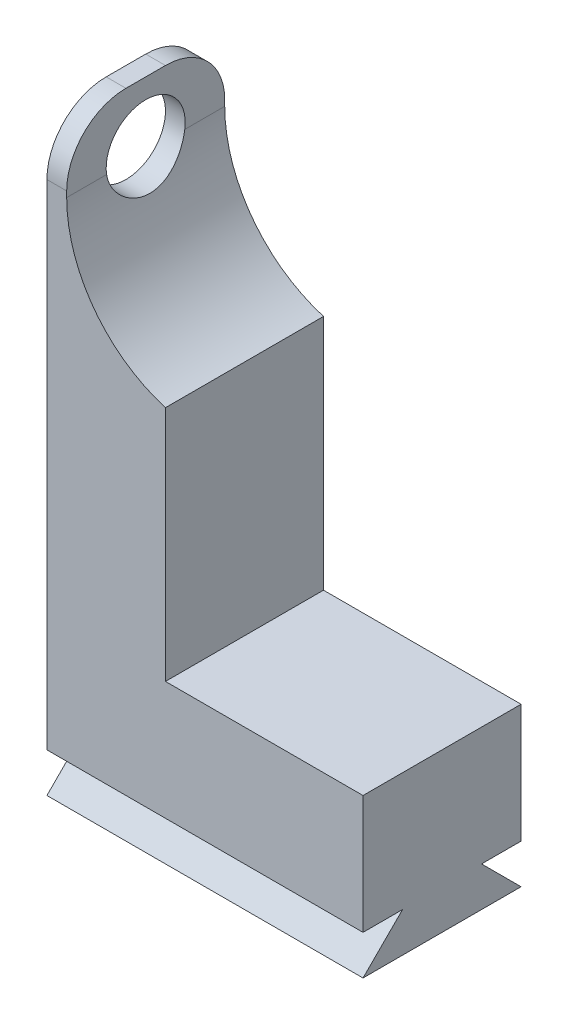
ISO-10303-21;
HEADER;
FILE_DESCRIPTION(('STEP AP214'),'2;1');
FILE_NAME('part.step','',(''),(''),'','','');
FILE_SCHEMA(('AUTOMOTIVE_DESIGN { 1 0 10303 214 1 1 1 1 }'));
ENDSEC;
DATA;
#1=APPLICATION_CONTEXT('core data for automotive mechanical design processes');
#2=APPLICATION_PROTOCOL_DEFINITION('international standard','automotive_design',2000,#1);
#3=PRODUCT_CONTEXT('',#1,'mechanical');
#4=PRODUCT('Part','Part','',(#3));
#5=PRODUCT_RELATED_PRODUCT_CATEGORY('part','',(#4));
#6=PRODUCT_DEFINITION_FORMATION('','',#4);
#7=PRODUCT_DEFINITION_CONTEXT('part definition',#1,'design');
#8=PRODUCT_DEFINITION('design','',#6,#7);
#9=PRODUCT_DEFINITION_SHAPE('','',#8);
#10=(LENGTH_UNIT() NAMED_UNIT(*) SI_UNIT(.MILLI.,.METRE.));
#11=(NAMED_UNIT(*) PLANE_ANGLE_UNIT() SI_UNIT($,.RADIAN.));
#12=(NAMED_UNIT(*) SI_UNIT($,.STERADIAN.) SOLID_ANGLE_UNIT());
#13=UNCERTAINTY_MEASURE_WITH_UNIT(LENGTH_MEASURE(1.E-05),#10,'distance_accuracy_value','');
#14=(GEOMETRIC_REPRESENTATION_CONTEXT(3) GLOBAL_UNCERTAINTY_ASSIGNED_CONTEXT((#13)) GLOBAL_UNIT_ASSIGNED_CONTEXT((#10,
#11,#12)) REPRESENTATION_CONTEXT('',''));
#15=CARTESIAN_POINT('',(0.,0.,0.));
#16=DIRECTION('',(0.,0.,1.));
#17=DIRECTION('',(1.,0.,0.));
#18=AXIS2_PLACEMENT_3D('',#15,#16,#17);
#19=CARTESIAN_POINT('',(6.,0.,0.));
#20=DIRECTION('',(-1.,0.,0.));
#21=DIRECTION('',(0.,0.,1.));
#22=AXIS2_PLACEMENT_3D('',#19,#20,#21);
#23=PLANE('',#22);
#24=DIRECTION('',(0.,0.,1.));
#25=VECTOR('',#24,1.);
#26=CARTESIAN_POINT('',(6.,-7.,-4.));
#27=LINE('',#26,#25);
#28=CARTESIAN_POINT('',(6.,-7.,-4.));
#29=VERTEX_POINT('',#28);
#30=CARTESIAN_POINT('',(6.,-7.,4.));
#31=VERTEX_POINT('',#30);
#32=EDGE_CURVE('E176',#29,#31,#27,.T.);
#33=ORIENTED_EDGE('',*,*,#32,.F.);
#34=DIRECTION('',(0.,1.,0.));
#35=VECTOR('',#34,1.);
#36=CARTESIAN_POINT('',(6.,-15.,-4.));
#37=LINE('',#36,#35);
#38=CARTESIAN_POINT('',(6.,5.,-4.));
#39=VERTEX_POINT('',#38);
#40=EDGE_CURVE('E200',#29,#39,#37,.T.);
#41=ORIENTED_EDGE('',*,*,#40,.T.);
#42=DIRECTION('',(0.,0.,-1.));
#43=VECTOR('',#42,1.);
#44=CARTESIAN_POINT('',(6.,5.,-4.));
#45=LINE('',#44,#43);
#46=CARTESIAN_POINT('',(6.,5.,4.));
#47=VERTEX_POINT('',#46);
#48=EDGE_CURVE('E188',#47,#39,#45,.T.);
#49=ORIENTED_EDGE('',*,*,#48,.F.);
#50=DIRECTION('',(0.,-1.,0.));
#51=VECTOR('',#50,1.);
#52=CARTESIAN_POINT('',(6.,-15.,4.));
#53=LINE('',#52,#51);
#54=EDGE_CURVE('E202',#47,#31,#53,.T.);
#55=ORIENTED_EDGE('',*,*,#54,.T.);
#56=EDGE_LOOP('',(#33,#41,#49,#55));
#57=FACE_BOUND('',#56,.T.);
#58=ADVANCED_FACE('F36',(#57),#23,.F.);
#59=CARTESIAN_POINT('',(6.,-15.,-4.));
#60=DIRECTION('',(0.,0.,1.));
#61=DIRECTION('',(1.,0.,0.));
#62=AXIS2_PLACEMENT_3D('',#59,#60,#61);
#63=PLANE('',#62);
#64=DIRECTION('',(0.,1.,0.));
#65=VECTOR('',#64,1.);
#66=CARTESIAN_POINT('',(16.,-15.,-4.));
#67=LINE('',#66,#65);
#68=CARTESIAN_POINT('',(16.,-13.,-4.));
#69=VERTEX_POINT('',#68);
#70=CARTESIAN_POINT('',(16.,-7.,-4.));
#71=VERTEX_POINT('',#70);
#72=EDGE_CURVE('E178',#69,#71,#67,.T.);
#73=ORIENTED_EDGE('',*,*,#72,.F.);
#74=DIRECTION('',(-1.,0.,0.));
#75=VECTOR('',#74,1.);
#76=CARTESIAN_POINT('',(16.001,-13.,-4.));
#77=LINE('',#76,#75);
#78=CARTESIAN_POINT('',(0.,-13.,-4.));
#79=VERTEX_POINT('',#78);
#80=EDGE_CURVE('E60',#69,#79,#77,.T.);
#81=ORIENTED_EDGE('',*,*,#80,.T.);
#82=DIRECTION('',(0.,1.,0.));
#83=VECTOR('',#82,1.);
#84=CARTESIAN_POINT('',(0.,-15.,-4.));
#85=LINE('',#84,#83);
#86=CARTESIAN_POINT('',(0.,12.,-4.));
#87=VERTEX_POINT('',#86);
#88=EDGE_CURVE('E197',#79,#87,#85,.T.);
#89=ORIENTED_EDGE('',*,*,#88,.T.);
#90=DIRECTION('',(-1.,0.,0.));
#91=VECTOR('',#90,1.);
#92=CARTESIAN_POINT('',(6.,12.,-4.));
#93=LINE('',#92,#91);
#94=CARTESIAN_POINT('',(1.,12.,-4.));
#95=VERTEX_POINT('',#94);
#96=EDGE_CURVE('E223',#87,#95,#93,.F.);
#97=ORIENTED_EDGE('',*,*,#96,.T.);
#98=DIRECTION('',(0.,1.,0.));
#99=VECTOR('',#98,1.);
#100=CARTESIAN_POINT('',(1.,15.,-4.));
#101=LINE('',#100,#99);
#102=CARTESIAN_POINT('',(1.,11.7082039324994,-4.));
#103=VERTEX_POINT('',#102);
#104=EDGE_CURVE('E189',#103,#95,#101,.T.);
#105=ORIENTED_EDGE('',*,*,#104,.F.);
#106=CARTESIAN_POINT('',(8.,11.7082039324994,-4.));
#107=DIRECTION('',(0.,0.,1.));
#108=DIRECTION('',(1.,0.,0.));
#109=AXIS2_PLACEMENT_3D('',#106,#107,#108);
#110=CIRCLE('',#109,7.);
#111=EDGE_CURVE('E45',#103,#39,#110,.T.);
#112=ORIENTED_EDGE('',*,*,#111,.T.);
#113=ORIENTED_EDGE('',*,*,#40,.F.);
#114=DIRECTION('',(-1.,0.,0.));
#115=VECTOR('',#114,1.);
#116=CARTESIAN_POINT('',(16.,-7.,-4.));
#117=LINE('',#116,#115);
#118=EDGE_CURVE('E170',#71,#29,#117,.T.);
#119=ORIENTED_EDGE('',*,*,#118,.F.);
#120=EDGE_LOOP('',(#73,#81,#89,#97,#105,#112,#113,#119));
#121=FACE_BOUND('',#120,.T.);
#122=ADVANCED_FACE('F260',(#121),#63,.F.);
#123=CARTESIAN_POINT('',(6.,15.,4.));
#124=DIRECTION('',(0.,-1.,0.));
#125=DIRECTION('',(0.,0.,-1.));
#126=AXIS2_PLACEMENT_3D('',#123,#124,#125);
#127=PLANE('',#126);
#128=DIRECTION('',(0.,0.,1.));
#129=VECTOR('',#128,1.);
#130=CARTESIAN_POINT('',(1.,15.,-4.));
#131=LINE('',#130,#129);
#132=CARTESIAN_POINT('',(1.,15.,-0.999999999999997));
#133=VERTEX_POINT('',#132);
#134=CARTESIAN_POINT('',(1.,15.,1.));
#135=VERTEX_POINT('',#134);
#136=EDGE_CURVE('E191',#133,#135,#131,.T.);
#137=ORIENTED_EDGE('',*,*,#136,.F.);
#138=DIRECTION('',(-1.,0.,0.));
#139=VECTOR('',#138,1.);
#140=CARTESIAN_POINT('',(6.,15.,-0.999999999999997));
#141=LINE('',#140,#139);
#142=CARTESIAN_POINT('',(0.,15.,-0.999999999999997));
#143=VERTEX_POINT('',#142);
#144=EDGE_CURVE('E215',#133,#143,#141,.T.);
#145=ORIENTED_EDGE('',*,*,#144,.T.);
#146=DIRECTION('',(0.,0.,1.));
#147=VECTOR('',#146,1.);
#148=CARTESIAN_POINT('',(0.,15.,4.));
#149=LINE('',#148,#147);
#150=CARTESIAN_POINT('',(0.,15.,1.));
#151=VERTEX_POINT('',#150);
#152=EDGE_CURVE('E206',#143,#151,#149,.T.);
#153=ORIENTED_EDGE('',*,*,#152,.T.);
#154=DIRECTION('',(-1.,0.,0.));
#155=VECTOR('',#154,1.);
#156=CARTESIAN_POINT('',(6.,15.,1.));
#157=LINE('',#156,#155);
#158=EDGE_CURVE('E153',#151,#135,#157,.F.);
#159=ORIENTED_EDGE('',*,*,#158,.T.);
#160=EDGE_LOOP('',(#137,#145,#153,#159));
#161=FACE_BOUND('',#160,.T.);
#162=ADVANCED_FACE('F270',(#161),#127,.F.);
#163=CARTESIAN_POINT('',(6.,-15.,4.));
#164=DIRECTION('',(0.,0.,-1.));
#165=DIRECTION('',(-1.,0.,0.));
#166=AXIS2_PLACEMENT_3D('',#163,#164,#165);
#167=PLANE('',#166);
#168=DIRECTION('',(0.,-1.,0.));
#169=VECTOR('',#168,1.);
#170=CARTESIAN_POINT('',(0.,-15.,4.));
#171=LINE('',#170,#169);
#172=CARTESIAN_POINT('',(0.,12.,4.));
#173=VERTEX_POINT('',#172);
#174=CARTESIAN_POINT('',(0.,-13.,4.));
#175=VERTEX_POINT('',#174);
#176=EDGE_CURVE('E209',#173,#175,#171,.T.);
#177=ORIENTED_EDGE('',*,*,#176,.T.);
#178=DIRECTION('',(-1.,0.,0.));
#179=VECTOR('',#178,1.);
#180=CARTESIAN_POINT('',(16.001,-13.,4.));
#181=LINE('',#180,#179);
#182=CARTESIAN_POINT('',(16.,-13.,4.));
#183=VERTEX_POINT('',#182);
#184=EDGE_CURVE('E316',#183,#175,#181,.T.);
#185=ORIENTED_EDGE('',*,*,#184,.F.);
#186=DIRECTION('',(0.,-1.,0.));
#187=VECTOR('',#186,1.);
#188=CARTESIAN_POINT('',(16.,-15.,4.));
#189=LINE('',#188,#187);
#190=CARTESIAN_POINT('',(16.,-7.,4.));
#191=VERTEX_POINT('',#190);
#192=EDGE_CURVE('E167',#191,#183,#189,.T.);
#193=ORIENTED_EDGE('',*,*,#192,.F.);
#194=DIRECTION('',(-1.,0.,0.));
#195=VECTOR('',#194,1.);
#196=CARTESIAN_POINT('',(16.,-7.,4.));
#197=LINE('',#196,#195);
#198=EDGE_CURVE('E166',#191,#31,#197,.T.);
#199=ORIENTED_EDGE('',*,*,#198,.T.);
#200=ORIENTED_EDGE('',*,*,#54,.F.);
#201=CARTESIAN_POINT('',(8.,11.7082039324994,4.));
#202=DIRECTION('',(0.,0.,-1.));
#203=DIRECTION('',(-1.,0.,0.));
#204=AXIS2_PLACEMENT_3D('',#201,#202,#203);
#205=CIRCLE('',#204,7.);
#206=CARTESIAN_POINT('',(1.,11.7082039324994,4.));
#207=VERTEX_POINT('',#206);
#208=EDGE_CURVE('E11',#47,#207,#205,.T.);
#209=ORIENTED_EDGE('',*,*,#208,.T.);
#210=DIRECTION('',(0.,-1.,0.));
#211=VECTOR('',#210,1.);
#212=CARTESIAN_POINT('',(1.,15.,4.));
#213=LINE('',#212,#211);
#214=CARTESIAN_POINT('',(1.,12.,4.));
#215=VERTEX_POINT('',#214);
#216=EDGE_CURVE('E194',#215,#207,#213,.T.);
#217=ORIENTED_EDGE('',*,*,#216,.F.);
#218=DIRECTION('',(-1.,0.,0.));
#219=VECTOR('',#218,1.);
#220=CARTESIAN_POINT('',(6.,12.,4.));
#221=LINE('',#220,#219);
#222=EDGE_CURVE('E230',#215,#173,#221,.T.);
#223=ORIENTED_EDGE('',*,*,#222,.T.);
#224=EDGE_LOOP('',(#177,#185,#193,#199,#200,#209,#217,#223));
#225=FACE_BOUND('',#224,.T.);
#226=ADVANCED_FACE('F267',(#225),#167,.F.);
#227=CARTESIAN_POINT('',(6.,-15.,4.));
#228=DIRECTION('',(0.,1.,0.));
#229=DIRECTION('',(0.,0.,1.));
#230=AXIS2_PLACEMENT_3D('',#227,#228,#229);
#231=PLANE('',#230);
#232=DIRECTION('',(0.,0.,-1.));
#233=VECTOR('',#232,1.);
#234=CARTESIAN_POINT('',(0.,-15.,4.));
#235=LINE('',#234,#233);
#236=CARTESIAN_POINT('',(0.,-15.,4.));
#237=VERTEX_POINT('',#236);
#238=CARTESIAN_POINT('',(0.,-15.,-4.));
#239=VERTEX_POINT('',#238);
#240=EDGE_CURVE('E203',#237,#239,#235,.T.);
#241=ORIENTED_EDGE('',*,*,#240,.T.);
#242=DIRECTION('',(-1.,0.,0.));
#243=VECTOR('',#242,1.);
#244=CARTESIAN_POINT('',(6.,-15.,-4.));
#245=LINE('',#244,#243);
#246=CARTESIAN_POINT('',(16.,-15.,-4.));
#247=VERTEX_POINT('',#246);
#248=EDGE_CURVE('E154',#247,#239,#245,.T.);
#249=ORIENTED_EDGE('',*,*,#248,.F.);
#250=DIRECTION('',(0.,0.,-1.));
#251=VECTOR('',#250,1.);
#252=CARTESIAN_POINT('',(16.,-15.,-4.));
#253=LINE('',#252,#251);
#254=CARTESIAN_POINT('',(16.,-15.,4.));
#255=VERTEX_POINT('',#254);
#256=EDGE_CURVE('E160',#255,#247,#253,.T.);
#257=ORIENTED_EDGE('',*,*,#256,.F.);
#258=DIRECTION('',(-1.,0.,0.));
#259=VECTOR('',#258,1.);
#260=CARTESIAN_POINT('',(6.,-15.,4.));
#261=LINE('',#260,#259);
#262=EDGE_CURVE('E142',#255,#237,#261,.T.);
#263=ORIENTED_EDGE('',*,*,#262,.T.);
#264=EDGE_LOOP('',(#241,#249,#257,#263));
#265=FACE_BOUND('',#264,.T.);
#266=ADVANCED_FACE('F165',(#265),#231,.F.);
#267=CARTESIAN_POINT('',(0.,0.,0.));
#268=DIRECTION('',(-1.,0.,0.));
#269=DIRECTION('',(0.,0.,1.));
#270=AXIS2_PLACEMENT_3D('',#267,#268,#269);
#271=PLANE('',#270);
#272=DIRECTION('',(0.,-0.707106781186548,0.707106781186548));
#273=VECTOR('',#272,1.);
#274=CARTESIAN_POINT('',(0.,-13.,2.));
#275=LINE('',#274,#273);
#276=CARTESIAN_POINT('',(0.,-13.,2.));
#277=VERTEX_POINT('',#276);
#278=EDGE_CURVE('E148',#277,#237,#275,.T.);
#279=ORIENTED_EDGE('',*,*,#278,.F.);
#280=DIRECTION('',(0.,0.,-1.));
#281=VECTOR('',#280,1.);
#282=CARTESIAN_POINT('',(0.,-13.,4.));
#283=LINE('',#282,#281);
#284=EDGE_CURVE('E313',#175,#277,#283,.T.);
#285=ORIENTED_EDGE('',*,*,#284,.F.);
#286=ORIENTED_EDGE('',*,*,#176,.F.);
#287=CARTESIAN_POINT('',(0.,12.,1.));
#288=DIRECTION('',(-1.,0.,0.));
#289=DIRECTION('',(0.,0.,1.));
#290=AXIS2_PLACEMENT_3D('',#287,#288,#289);
#291=CIRCLE('',#290,3.);
#292=EDGE_CURVE('E218',#173,#151,#291,.T.);
#293=ORIENTED_EDGE('',*,*,#292,.T.);
#294=ORIENTED_EDGE('',*,*,#152,.F.);
#295=CARTESIAN_POINT('',(0.,12.,-0.999999999999997));
#296=DIRECTION('',(-1.,0.,0.));
#297=DIRECTION('',(0.,0.,1.));
#298=AXIS2_PLACEMENT_3D('',#295,#296,#297);
#299=CIRCLE('',#298,3.);
#300=EDGE_CURVE('E220',#143,#87,#299,.T.);
#301=ORIENTED_EDGE('',*,*,#300,.T.);
#302=ORIENTED_EDGE('',*,*,#88,.F.);
#303=DIRECTION('',(0.,0.,-1.));
#304=VECTOR('',#303,1.);
#305=CARTESIAN_POINT('',(0.,-13.,-4.));
#306=LINE('',#305,#304);
#307=CARTESIAN_POINT('',(0.,-13.,-2.));
#308=VERTEX_POINT('',#307);
#309=EDGE_CURVE('E327',#308,#79,#306,.T.);
#310=ORIENTED_EDGE('',*,*,#309,.F.);
#311=DIRECTION('',(0.,0.707106781186548,0.707106781186548));
#312=VECTOR('',#311,1.);
#313=CARTESIAN_POINT('',(0.,-13.,-2.));
#314=LINE('',#313,#312);
#315=EDGE_CURVE('E330',#239,#308,#314,.T.);
#316=ORIENTED_EDGE('',*,*,#315,.F.);
#317=ORIENTED_EDGE('',*,*,#240,.F.);
#318=EDGE_LOOP('',(#279,#285,#286,#293,#294,#301,#302,#310,#316,#317));
#319=FACE_BOUND('',#318,.T.);
#320=CARTESIAN_POINT('',(0.,12.,0.));
#321=DIRECTION('',(-1.,0.,0.));
#322=DIRECTION('',(0.,0.,1.));
#323=AXIS2_PLACEMENT_3D('',#320,#321,#322);
#324=CIRCLE('',#323,2.);
#325=CARTESIAN_POINT('',(0.,12.,2.));
#326=VERTEX_POINT('',#325);
#327=EDGE_CURVE('E182',#326,#326,#324,.T.);
#328=ORIENTED_EDGE('',*,*,#327,.F.);
#329=EDGE_LOOP('',(#328));
#330=FACE_BOUND('',#329,.T.);
#331=ADVANCED_FACE('F256',(#319,#330),#271,.T.);
#332=CARTESIAN_POINT('',(1.,0.,0.));
#333=DIRECTION('',(-1.,0.,0.));
#334=DIRECTION('',(0.,0.,1.));
#335=AXIS2_PLACEMENT_3D('',#332,#333,#334);
#336=PLANE('',#335);
#337=ORIENTED_EDGE('',*,*,#216,.T.);
#338=DIRECTION('',(0.,0.,-1.));
#339=VECTOR('',#338,1.);
#340=CARTESIAN_POINT('',(1.,11.7082039324994,0.));
#341=LINE('',#340,#339);
#342=CARTESIAN_POINT('',(1.,11.7082039324994,1.97859926589271));
#343=VERTEX_POINT('',#342);
#344=EDGE_CURVE('E235',#207,#343,#341,.T.);
#345=ORIENTED_EDGE('',*,*,#344,.T.);
#346=CARTESIAN_POINT('',(1.,12.,0.));
#347=DIRECTION('',(-1.,0.,0.));
#348=DIRECTION('',(0.,0.,1.));
#349=AXIS2_PLACEMENT_3D('',#346,#347,#348);
#350=CIRCLE('',#349,2.);
#351=CARTESIAN_POINT('',(1.,11.7082039324994,-1.97859926589271));
#352=VERTEX_POINT('',#351);
#353=EDGE_CURVE('E185',#352,#343,#350,.F.);
#354=ORIENTED_EDGE('',*,*,#353,.F.);
#355=DIRECTION('',(0.,0.,-1.));
#356=VECTOR('',#355,1.);
#357=CARTESIAN_POINT('',(1.,11.7082039324994,0.));
#358=LINE('',#357,#356);
#359=EDGE_CURVE('E233',#352,#103,#358,.T.);
#360=ORIENTED_EDGE('',*,*,#359,.T.);
#361=ORIENTED_EDGE('',*,*,#104,.T.);
#362=CARTESIAN_POINT('',(1.,12.,-0.999999999999997));
#363=DIRECTION('',(-1.,0.,0.));
#364=DIRECTION('',(0.,0.,1.));
#365=AXIS2_PLACEMENT_3D('',#362,#363,#364);
#366=CIRCLE('',#365,3.);
#367=EDGE_CURVE('E228',#95,#133,#366,.F.);
#368=ORIENTED_EDGE('',*,*,#367,.T.);
#369=ORIENTED_EDGE('',*,*,#136,.T.);
#370=CARTESIAN_POINT('',(1.,12.,1.));
#371=DIRECTION('',(-1.,0.,0.));
#372=DIRECTION('',(0.,0.,1.));
#373=AXIS2_PLACEMENT_3D('',#370,#371,#372);
#374=CIRCLE('',#373,3.);
#375=EDGE_CURVE('E226',#135,#215,#374,.F.);
#376=ORIENTED_EDGE('',*,*,#375,.T.);
#377=EDGE_LOOP('',(#337,#345,#354,#360,#361,#368,#369,#376));
#378=FACE_BOUND('',#377,.T.);
#379=ADVANCED_FACE('F250',(#378),#336,.F.);
#380=CARTESIAN_POINT('',(6.001,12.,0.));
#381=DIRECTION('',(-1.,0.,0.));
#382=DIRECTION('',(0.,0.,1.));
#383=AXIS2_PLACEMENT_3D('',#380,#381,#382);
#384=CYLINDRICAL_SURFACE('',#383,2.);
#385=ORIENTED_EDGE('',*,*,#327,.T.);
#386=EDGE_LOOP('',(#385));
#387=FACE_BOUND('',#386,.T.);
#388=ORIENTED_EDGE('',*,*,#353,.T.);
#389=CARTESIAN_POINT('',(1.,11.7082039324994,1.97859926589271));
#390=CARTESIAN_POINT('',(0.999996562860208,11.6534103102538,1.97051932659087));
#391=CARTESIAN_POINT('',(1.00064404270127,11.5989809996655,1.96016445126653));
#392=CARTESIAN_POINT('',(1.00315721427137,11.49120493273,1.93499130449663));
#393=CARTESIAN_POINT('',(1.00502264953323,11.4378579509127,1.92017397307266));
#394=CARTESIAN_POINT('',(1.01230680676171,11.2802425839352,1.86925021813744));
#395=CARTESIAN_POINT('',(1.0194143490975,11.1780774920176,1.8266240393413));
#396=CARTESIAN_POINT('',(1.03702704684094,10.9824747134704,1.72533764417593));
#397=CARTESIAN_POINT('',(1.0475313195301,10.8890347675325,1.66668159414998));
#398=CARTESIAN_POINT('',(1.07051537194149,10.7131591235795,1.53496264942972));
#399=CARTESIAN_POINT('',(1.08299578583143,10.6307269738072,1.46189512806379));
#400=CARTESIAN_POINT('',(1.10861741912857,10.4773357089019,1.30156361481695));
#401=CARTESIAN_POINT('',(1.1217670864165,10.406662543328,1.21402731013548));
#402=CARTESIAN_POINT('',(1.14676062553112,10.2808868048644,1.02821948254142));
#403=CARTESIAN_POINT('',(1.15860439493489,10.2257854527592,0.929947118790279));
#404=CARTESIAN_POINT('',(1.17948806740025,10.1324722060938,0.724656504967221));
#405=CARTESIAN_POINT('',(1.18851038586016,10.0943656276487,0.617588458544428));
#406=CARTESIAN_POINT('',(1.20240758381608,10.0367893877439,0.398304492566966));
#407=CARTESIAN_POINT('',(1.20728348602075,10.0173151304958,0.286089849615024));
#408=CARTESIAN_POINT('',(1.21213818189386,9.99793230877699,0.0628453308607681));
#409=CARTESIAN_POINT('',(1.21224180665944,9.99752499501717,-0.0481386847254634));
#410=CARTESIAN_POINT('',(1.20785408072726,10.0150314718204,-0.268553705349644));
#411=CARTESIAN_POINT('',(1.20336291948162,10.0329445069992,-0.377984774230044));
#412=CARTESIAN_POINT('',(1.19046580159736,10.0861760662486,-0.590919969243101));
#413=CARTESIAN_POINT('',(1.18210561885863,10.1212913496116,-0.694477918393925));
#414=CARTESIAN_POINT('',(1.162556299992,10.2077645910928,-0.894285662048947));
#415=CARTESIAN_POINT('',(1.15136677722658,10.2591247693636,-0.990534455396505));
#416=CARTESIAN_POINT('',(1.12726800273844,10.3780497571907,-1.1754321377698));
#417=CARTESIAN_POINT('',(1.11432474137647,10.445964420414,-1.26385154889354));
#418=CARTESIAN_POINT('',(1.08857868933361,10.5955484465296,-1.42823943841375));
#419=CARTESIAN_POINT('',(1.07577593952752,10.6772217044483,-1.5042043789277));
#420=CARTESIAN_POINT('',(1.05175529370202,10.8538181020398,-1.64289585425982));
#421=CARTESIAN_POINT('',(1.04057083092641,10.9489570763649,-1.70535357166439));
#422=CARTESIAN_POINT('',(1.02168130333407,11.148669330584,-1.81330736430922));
#423=CARTESIAN_POINT('',(1.01397215975283,11.253231377278,-1.85882331204387));
#424=CARTESIAN_POINT('',(1.00581287837113,11.4174018870769,-1.91419633667263));
#425=CARTESIAN_POINT('',(1.00365410487768,11.4747579839976,-1.93071995661781));
#426=CARTESIAN_POINT('',(1.00074609083548,11.5906711104765,-1.95857011123507));
#427=CARTESIAN_POINT('',(0.999994957876539,11.6492264205451,-1.96990360790725));
#428=CARTESIAN_POINT('',(1.,11.7082039324994,-1.97859926589271));
#429=B_SPLINE_CURVE_WITH_KNOTS('',3,(#389,#390,#391,#392,#393,#394,#395,#396,#397,#398,#399,
#400,#401,#402,#403,#404,#405,#406,#407,#408,#409,#410,#411,#412,#413,#414,#415,#416,#417,#418,
#419,#420,#421,#422,#423,#424,#425,#426,#427,#428),.UNSPECIFIED.,.F.,.F.,(4,2,2,2,2,2,2,2,2,2,2,
2,2,2,2,2,2,2,2,4),(0.,0.166051375892929,0.332067797305901,0.66313594191583,0.994118119905654,
1.32520673017662,1.66343964047296,2.00169905988474,2.34202648622498,2.6822699468417,
3.01360827437928,3.34493294073255,3.67243419745032,3.99998023237168,4.33516209061209,
4.67043899802242,5.01187479596643,5.35290882213419,5.53186702270183,5.71058446155445),.UNSPECIFIED.);
#430=EDGE_CURVE('E238',#343,#352,#429,.T.);
#431=ORIENTED_EDGE('',*,*,#430,.T.);
#432=EDGE_LOOP('',(#388,#431));
#433=FACE_BOUND('',#432,.T.);
#434=ADVANCED_FACE('F244',(#387,#433),#384,.F.);
#435=CARTESIAN_POINT('',(6.,12.,-0.999999999999997));
#436=DIRECTION('',(-1.,0.,0.));
#437=DIRECTION('',(0.,0.,1.));
#438=AXIS2_PLACEMENT_3D('',#435,#436,#437);
#439=CYLINDRICAL_SURFACE('',#438,3.);
#440=ORIENTED_EDGE('',*,*,#367,.F.);
#441=ORIENTED_EDGE('',*,*,#96,.F.);
#442=ORIENTED_EDGE('',*,*,#300,.F.);
#443=ORIENTED_EDGE('',*,*,#144,.F.);
#444=EDGE_LOOP('',(#440,#441,#442,#443));
#445=FACE_BOUND('',#444,.T.);
#446=ADVANCED_FACE('F249',(#445),#439,.T.);
#447=CARTESIAN_POINT('',(6.,12.,1.));
#448=DIRECTION('',(-1.,0.,0.));
#449=DIRECTION('',(0.,0.,1.));
#450=AXIS2_PLACEMENT_3D('',#447,#448,#449);
#451=CYLINDRICAL_SURFACE('',#450,3.);
#452=ORIENTED_EDGE('',*,*,#375,.F.);
#453=ORIENTED_EDGE('',*,*,#158,.F.);
#454=ORIENTED_EDGE('',*,*,#292,.F.);
#455=ORIENTED_EDGE('',*,*,#222,.F.);
#456=EDGE_LOOP('',(#452,#453,#454,#455));
#457=FACE_BOUND('',#456,.T.);
#458=ADVANCED_FACE('F279',(#457),#451,.T.);
#459=CARTESIAN_POINT('',(8.,11.7082039324994,-4.));
#460=DIRECTION('',(0.,0.,-1.));
#461=DIRECTION('',(0.,1.,0.));
#462=AXIS2_PLACEMENT_3D('',#459,#460,#461);
#463=CYLINDRICAL_SURFACE('',#462,7.);
#464=ORIENTED_EDGE('',*,*,#208,.F.);
#465=ORIENTED_EDGE('',*,*,#48,.T.);
#466=ORIENTED_EDGE('',*,*,#111,.F.);
#467=ORIENTED_EDGE('',*,*,#359,.F.);
#468=ORIENTED_EDGE('',*,*,#430,.F.);
#469=ORIENTED_EDGE('',*,*,#344,.F.);
#470=EDGE_LOOP('',(#464,#465,#466,#467,#468,#469));
#471=FACE_BOUND('',#470,.T.);
#472=ADVANCED_FACE('F38',(#471),#463,.F.);
#473=CARTESIAN_POINT('',(16.,-7.,-4.));
#474=DIRECTION('',(0.,-1.,0.));
#475=DIRECTION('',(0.,0.,-1.));
#476=AXIS2_PLACEMENT_3D('',#473,#474,#475);
#477=PLANE('',#476);
#478=ORIENTED_EDGE('',*,*,#32,.T.);
#479=ORIENTED_EDGE('',*,*,#198,.F.);
#480=DIRECTION('',(0.,0.,1.));
#481=VECTOR('',#480,1.);
#482=CARTESIAN_POINT('',(16.,-7.,-4.));
#483=LINE('',#482,#481);
#484=EDGE_CURVE('E172',#71,#191,#483,.T.);
#485=ORIENTED_EDGE('',*,*,#484,.F.);
#486=ORIENTED_EDGE('',*,*,#118,.T.);
#487=EDGE_LOOP('',(#478,#479,#485,#486));
#488=FACE_BOUND('',#487,.T.);
#489=ADVANCED_FACE('F252',(#488),#477,.F.);
#490=CARTESIAN_POINT('',(16.,0.,0.));
#491=DIRECTION('',(1.,0.,0.));
#492=DIRECTION('',(0.,0.,-1.));
#493=AXIS2_PLACEMENT_3D('',#490,#491,#492);
#494=PLANE('',#493);
#495=DIRECTION('',(0.,-0.707106781186548,0.707106781186548));
#496=VECTOR('',#495,1.);
#497=CARTESIAN_POINT('',(16.,-13.,2.));
#498=LINE('',#497,#496);
#499=CARTESIAN_POINT('',(16.,-13.,2.));
#500=VERTEX_POINT('',#499);
#501=EDGE_CURVE('E145',#500,#255,#498,.T.);
#502=ORIENTED_EDGE('',*,*,#501,.T.);
#503=ORIENTED_EDGE('',*,*,#256,.T.);
#504=DIRECTION('',(0.,0.707106781186548,0.707106781186548));
#505=VECTOR('',#504,1.);
#506=CARTESIAN_POINT('',(16.,-13.,-2.));
#507=LINE('',#506,#505);
#508=CARTESIAN_POINT('',(16.,-13.,-2.));
#509=VERTEX_POINT('',#508);
#510=EDGE_CURVE('E333',#247,#509,#507,.T.);
#511=ORIENTED_EDGE('',*,*,#510,.T.);
#512=DIRECTION('',(0.,0.,-1.));
#513=VECTOR('',#512,1.);
#514=CARTESIAN_POINT('',(16.,-13.,-4.));
#515=LINE('',#514,#513);
#516=EDGE_CURVE('E323',#509,#69,#515,.T.);
#517=ORIENTED_EDGE('',*,*,#516,.T.);
#518=ORIENTED_EDGE('',*,*,#72,.T.);
#519=ORIENTED_EDGE('',*,*,#484,.T.);
#520=ORIENTED_EDGE('',*,*,#192,.T.);
#521=DIRECTION('',(0.,0.,-1.));
#522=VECTOR('',#521,1.);
#523=CARTESIAN_POINT('',(16.,-13.,4.));
#524=LINE('',#523,#522);
#525=EDGE_CURVE('E162',#183,#500,#524,.T.);
#526=ORIENTED_EDGE('',*,*,#525,.T.);
#527=EDGE_LOOP('',(#502,#503,#511,#517,#518,#519,#520,#526));
#528=FACE_BOUND('',#527,.T.);
#529=ADVANCED_FACE('F158',(#528),#494,.T.);
#530=CARTESIAN_POINT('',(16.001,-13.,-2.));
#531=DIRECTION('',(0.,-0.707106781186547,0.707106781186547));
#532=DIRECTION('',(0.,-0.707106781186548,-0.707106781186548));
#533=AXIS2_PLACEMENT_3D('',#530,#531,#532);
#534=PLANE('',#533);
#535=ORIENTED_EDGE('',*,*,#248,.T.);
#536=ORIENTED_EDGE('',*,*,#315,.T.);
#537=DIRECTION('',(-1.,0.,0.));
#538=VECTOR('',#537,1.);
#539=CARTESIAN_POINT('',(16.001,-13.,-2.));
#540=LINE('',#539,#538);
#541=EDGE_CURVE('E325',#509,#308,#540,.T.);
#542=ORIENTED_EDGE('',*,*,#541,.F.);
#543=ORIENTED_EDGE('',*,*,#510,.F.);
#544=EDGE_LOOP('',(#535,#536,#542,#543));
#545=FACE_BOUND('',#544,.T.);
#546=ADVANCED_FACE('F342',(#545),#534,.F.);
#547=CARTESIAN_POINT('',(16.001,-13.,-4.));
#548=DIRECTION('',(0.,1.,0.));
#549=DIRECTION('',(0.,0.,1.));
#550=AXIS2_PLACEMENT_3D('',#547,#548,#549);
#551=PLANE('',#550);
#552=ORIENTED_EDGE('',*,*,#541,.T.);
#553=ORIENTED_EDGE('',*,*,#309,.T.);
#554=ORIENTED_EDGE('',*,*,#80,.F.);
#555=ORIENTED_EDGE('',*,*,#516,.F.);
#556=EDGE_LOOP('',(#552,#553,#554,#555));
#557=FACE_BOUND('',#556,.T.);
#558=ADVANCED_FACE('F343',(#557),#551,.F.);
#559=CARTESIAN_POINT('',(16.001,-13.,2.));
#560=DIRECTION('',(0.,-0.707106781186547,-0.707106781186547));
#561=DIRECTION('',(0.,0.707106781186548,-0.707106781186548));
#562=AXIS2_PLACEMENT_3D('',#559,#560,#561);
#563=PLANE('',#562);
#564=DIRECTION('',(-1.,0.,0.));
#565=VECTOR('',#564,1.);
#566=CARTESIAN_POINT('',(16.001,-13.,2.));
#567=LINE('',#566,#565);
#568=EDGE_CURVE('E52',#500,#277,#567,.T.);
#569=ORIENTED_EDGE('',*,*,#568,.T.);
#570=ORIENTED_EDGE('',*,*,#278,.T.);
#571=ORIENTED_EDGE('',*,*,#262,.F.);
#572=ORIENTED_EDGE('',*,*,#501,.F.);
#573=EDGE_LOOP('',(#569,#570,#571,#572));
#574=FACE_BOUND('',#573,.T.);
#575=ADVANCED_FACE('F144',(#574),#563,.F.);
#576=CARTESIAN_POINT('',(16.001,-13.,4.));
#577=DIRECTION('',(0.,1.,0.));
#578=DIRECTION('',(0.,0.,1.));
#579=AXIS2_PLACEMENT_3D('',#576,#577,#578);
#580=PLANE('',#579);
#581=ORIENTED_EDGE('',*,*,#184,.T.);
#582=ORIENTED_EDGE('',*,*,#284,.T.);
#583=ORIENTED_EDGE('',*,*,#568,.F.);
#584=ORIENTED_EDGE('',*,*,#525,.F.);
#585=EDGE_LOOP('',(#581,#582,#583,#584));
#586=FACE_BOUND('',#585,.T.);
#587=ADVANCED_FACE('F338',(#586),#580,.F.);
#588=CLOSED_SHELL('',(#58,#122,#162,#226,#266,#331,#379,#434,#446,#458,#472,#489,#529,#546,#558,
#575,#587));
#589=MANIFOLD_SOLID_BREP('B2',#588);
#590=ADVANCED_BREP_SHAPE_REPRESENTATION('',(#18,#589),#14);
#591=SHAPE_DEFINITION_REPRESENTATION(#9,#590);
ENDSEC;
END-ISO-10303-21;
